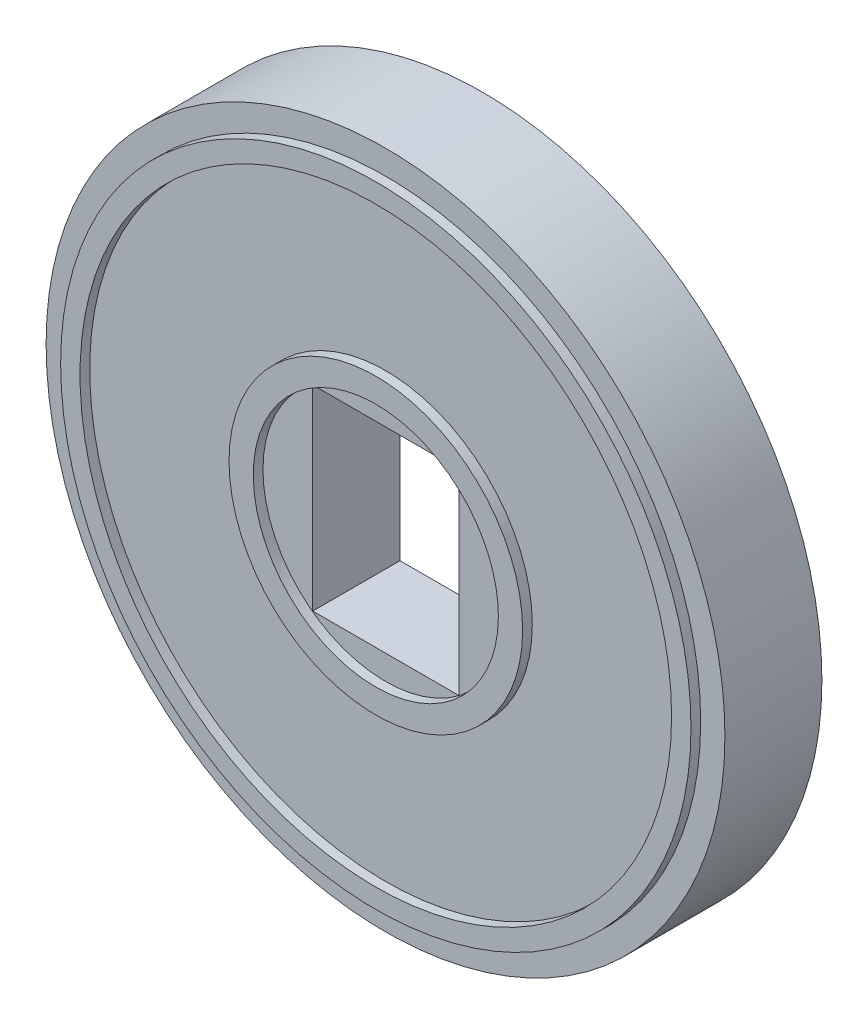
ISO-10303-21;
HEADER;
FILE_DESCRIPTION(('STEP AP214'),'2;1');
FILE_NAME('part.step','',(''),(''),'','','');
FILE_SCHEMA(('AUTOMOTIVE_DESIGN { 1 0 10303 214 1 1 1 1 }'));
ENDSEC;
DATA;
#1=APPLICATION_CONTEXT('core data for automotive mechanical design processes');
#2=APPLICATION_PROTOCOL_DEFINITION('international standard','automotive_design',2000,#1);
#3=PRODUCT_CONTEXT('',#1,'mechanical');
#4=PRODUCT('Part','Part','',(#3));
#5=PRODUCT_RELATED_PRODUCT_CATEGORY('part','',(#4));
#6=PRODUCT_DEFINITION_FORMATION('','',#4);
#7=PRODUCT_DEFINITION_CONTEXT('part definition',#1,'design');
#8=PRODUCT_DEFINITION('design','',#6,#7);
#9=PRODUCT_DEFINITION_SHAPE('','',#8);
#10=(LENGTH_UNIT() NAMED_UNIT(*) SI_UNIT(.MILLI.,.METRE.));
#11=(NAMED_UNIT(*) PLANE_ANGLE_UNIT() SI_UNIT($,.RADIAN.));
#12=(NAMED_UNIT(*) SI_UNIT($,.STERADIAN.) SOLID_ANGLE_UNIT());
#13=UNCERTAINTY_MEASURE_WITH_UNIT(LENGTH_MEASURE(1.E-05),#10,'distance_accuracy_value','');
#14=(GEOMETRIC_REPRESENTATION_CONTEXT(3) GLOBAL_UNCERTAINTY_ASSIGNED_CONTEXT((#13)) GLOBAL_UNIT_ASSIGNED_CONTEXT((#10,
#11,#12)) REPRESENTATION_CONTEXT('',''));
#15=CARTESIAN_POINT('',(0.,0.,0.));
#16=DIRECTION('',(0.,0.,1.));
#17=DIRECTION('',(1.,0.,0.));
#18=AXIS2_PLACEMENT_3D('',#15,#16,#17);
#19=CARTESIAN_POINT('',(0.,0.,10.));
#20=DIRECTION('',(0.,0.,1.));
#21=DIRECTION('',(1.,0.,0.));
#22=AXIS2_PLACEMENT_3D('',#19,#20,#21);
#23=PLANE('',#22);
#24=CARTESIAN_POINT('',(0.,0.,10.));
#25=DIRECTION('',(0.,0.,1.));
#26=DIRECTION('',(1.,0.,0.));
#27=AXIS2_PLACEMENT_3D('',#24,#25,#26);
#28=CIRCLE('',#27,12.6370101289822);
#29=CARTESIAN_POINT('',(7.595,10.1,10.));
#30=VERTEX_POINT('',#29);
#31=CARTESIAN_POINT('',(7.595,-10.1,10.));
#32=VERTEX_POINT('',#31);
#33=EDGE_CURVE('E132',#30,#32,#28,.T.);
#34=ORIENTED_EDGE('',*,*,#33,.T.);
#35=DIRECTION('',(1.,0.,0.));
#36=VECTOR('',#35,1.);
#37=CARTESIAN_POINT('',(-7.505,-10.1,10.));
#38=LINE('',#37,#36);
#39=CARTESIAN_POINT('',(-7.505,-10.1,10.));
#40=VERTEX_POINT('',#39);
#41=EDGE_CURVE('E110',#40,#32,#38,.T.);
#42=ORIENTED_EDGE('',*,*,#41,.F.);
#43=DIRECTION('',(0.,-1.,0.));
#44=VECTOR('',#43,1.);
#45=CARTESIAN_POINT('',(-7.505,10.1,10.));
#46=LINE('',#45,#44);
#47=CARTESIAN_POINT('',(-7.505,10.1,10.));
#48=VERTEX_POINT('',#47);
#49=EDGE_CURVE('E129',#48,#40,#46,.T.);
#50=ORIENTED_EDGE('',*,*,#49,.F.);
#51=DIRECTION('',(-1.,0.,0.));
#52=VECTOR('',#51,1.);
#53=CARTESIAN_POINT('',(-7.505,10.1,10.));
#54=LINE('',#53,#52);
#55=EDGE_CURVE('E109',#30,#48,#54,.T.);
#56=ORIENTED_EDGE('',*,*,#55,.F.);
#57=EDGE_LOOP('',(#34,#42,#50,#56));
#58=FACE_BOUND('',#57,.T.);
#59=ADVANCED_FACE('F46',(#58),#23,.T.);
#60=EDGE_CURVE('E106',#32,#30,#28,.T.);
#61=ORIENTED_EDGE('',*,*,#60,.T.);
#62=DIRECTION('',(0.,1.,0.));
#63=VECTOR('',#62,1.);
#64=CARTESIAN_POINT('',(7.595,10.1,10.));
#65=LINE('',#64,#63);
#66=EDGE_CURVE('E103',#32,#30,#65,.T.);
#67=ORIENTED_EDGE('',*,*,#66,.F.);
#68=EDGE_LOOP('',(#61,#67));
#69=FACE_BOUND('',#68,.T.);
#70=ADVANCED_FACE('F104',(#69),#23,.T.);
#71=CARTESIAN_POINT('',(0.,0.,10.));
#72=DIRECTION('',(0.,0.,1.));
#73=DIRECTION('',(1.,0.,0.));
#74=AXIS2_PLACEMENT_3D('',#71,#72,#73);
#75=CIRCLE('',#74,15.1370101289823);
#76=CARTESIAN_POINT('',(15.1370101289823,0.,10.));
#77=VERTEX_POINT('',#76);
#78=EDGE_CURVE('E149',#77,#77,#75,.T.);
#79=ORIENTED_EDGE('',*,*,#78,.F.);
#80=EDGE_LOOP('',(#79));
#81=FACE_BOUND('',#80,.T.);
#82=CARTESIAN_POINT('',(0.,0.,10.));
#83=DIRECTION('',(0.,0.,1.));
#84=DIRECTION('',(1.,0.,0.));
#85=AXIS2_PLACEMENT_3D('',#82,#83,#84);
#86=CIRCLE('',#85,30.5);
#87=CARTESIAN_POINT('',(30.5,0.,10.));
#88=VERTEX_POINT('',#87);
#89=EDGE_CURVE('E185',#88,#88,#86,.F.);
#90=ORIENTED_EDGE('',*,*,#89,.F.);
#91=EDGE_LOOP('',(#90));
#92=FACE_BOUND('',#91,.T.);
#93=ADVANCED_FACE('F261',(#81,#92),#23,.T.);
#94=CARTESIAN_POINT('',(0.,0.,10.));
#95=DIRECTION('',(0.,0.,1.));
#96=DIRECTION('',(1.,0.,0.));
#97=AXIS2_PLACEMENT_3D('',#94,#95,#96);
#98=CIRCLE('',#97,32.5);
#99=CARTESIAN_POINT('',(32.5,0.,10.));
#100=VERTEX_POINT('',#99);
#101=EDGE_CURVE('E156',#100,#100,#98,.T.);
#102=ORIENTED_EDGE('',*,*,#101,.F.);
#103=EDGE_LOOP('',(#102));
#104=FACE_BOUND('',#103,.T.);
#105=CARTESIAN_POINT('',(0.,0.,10.));
#106=DIRECTION('',(0.,0.,1.));
#107=DIRECTION('',(1.,0.,0.));
#108=AXIS2_PLACEMENT_3D('',#105,#106,#107);
#109=CIRCLE('',#108,35.);
#110=CARTESIAN_POINT('',(35.,0.,10.));
#111=VERTEX_POINT('',#110);
#112=EDGE_CURVE('E181',#111,#111,#109,.T.);
#113=ORIENTED_EDGE('',*,*,#112,.T.);
#114=EDGE_LOOP('',(#113));
#115=FACE_BOUND('',#114,.T.);
#116=ADVANCED_FACE('F257',(#104,#115),#23,.T.);
#117=CARTESIAN_POINT('',(0.,0.,0.));
#118=DIRECTION('',(0.,0.,1.));
#119=DIRECTION('',(1.,0.,0.));
#120=AXIS2_PLACEMENT_3D('',#117,#118,#119);
#121=PLANE('',#120);
#122=DIRECTION('',(-1.,0.,0.));
#123=VECTOR('',#122,1.);
#124=CARTESIAN_POINT('',(-7.505,15.7712818196177,0.));
#125=LINE('',#124,#123);
#126=CARTESIAN_POINT('',(13.2662818196177,15.7712818196177,0.));
#127=VERTEX_POINT('',#126);
#128=CARTESIAN_POINT('',(-13.1762818196177,15.7712818196177,0.));
#129=VERTEX_POINT('',#128);
#130=EDGE_CURVE('E201',#127,#129,#125,.T.);
#131=ORIENTED_EDGE('',*,*,#130,.T.);
#132=DIRECTION('',(0.,-1.,0.));
#133=VECTOR('',#132,1.);
#134=CARTESIAN_POINT('',(-13.1762818196177,-10.1,0.));
#135=LINE('',#134,#133);
#136=CARTESIAN_POINT('',(-13.1762818196177,-15.7712818196177,0.));
#137=VERTEX_POINT('',#136);
#138=EDGE_CURVE('E204',#129,#137,#135,.T.);
#139=ORIENTED_EDGE('',*,*,#138,.T.);
#140=DIRECTION('',(1.,0.,0.));
#141=VECTOR('',#140,1.);
#142=CARTESIAN_POINT('',(7.595,-15.7712818196177,0.));
#143=LINE('',#142,#141);
#144=CARTESIAN_POINT('',(13.2662818196177,-15.7712818196177,0.));
#145=VERTEX_POINT('',#144);
#146=EDGE_CURVE('E195',#137,#145,#143,.T.);
#147=ORIENTED_EDGE('',*,*,#146,.T.);
#148=DIRECTION('',(0.,1.,0.));
#149=VECTOR('',#148,1.);
#150=CARTESIAN_POINT('',(13.2662818196177,10.1,0.));
#151=LINE('',#150,#149);
#152=EDGE_CURVE('E198',#145,#127,#151,.T.);
#153=ORIENTED_EDGE('',*,*,#152,.T.);
#154=EDGE_LOOP('',(#131,#139,#147,#153));
#155=FACE_BOUND('',#154,.T.);
#156=CARTESIAN_POINT('',(0.,25.,0.));
#157=DIRECTION('',(0.,0.,1.));
#158=DIRECTION('',(1.,0.,0.));
#159=AXIS2_PLACEMENT_3D('',#156,#157,#158);
#160=CIRCLE('',#159,5.1);
#161=CARTESIAN_POINT('',(5.1,25.,0.));
#162=VERTEX_POINT('',#161);
#163=EDGE_CURVE('E168',#162,#162,#160,.F.);
#164=ORIENTED_EDGE('',*,*,#163,.F.);
#165=EDGE_LOOP('',(#164));
#166=FACE_BOUND('',#165,.T.);
#167=CARTESIAN_POINT('',(0.,0.,0.));
#168=DIRECTION('',(0.,0.,1.));
#169=DIRECTION('',(1.,0.,0.));
#170=AXIS2_PLACEMENT_3D('',#167,#168,#169);
#171=CIRCLE('',#170,35.);
#172=CARTESIAN_POINT('',(35.,0.,0.));
#173=VERTEX_POINT('',#172);
#174=EDGE_CURVE('E180',#173,#173,#171,.T.);
#175=ORIENTED_EDGE('',*,*,#174,.F.);
#176=EDGE_LOOP('',(#175));
#177=FACE_BOUND('',#176,.T.);
#178=ADVANCED_FACE('F233',(#155,#166,#177),#121,.F.);
#179=CARTESIAN_POINT('',(0.,0.,10.));
#180=DIRECTION('',(0.,0.,-1.));
#181=DIRECTION('',(-1.,0.,0.));
#182=AXIS2_PLACEMENT_3D('',#179,#180,#181);
#183=CYLINDRICAL_SURFACE('',#182,35.);
#184=ORIENTED_EDGE('',*,*,#112,.F.);
#185=EDGE_LOOP('',(#184));
#186=FACE_BOUND('',#185,.T.);
#187=ORIENTED_EDGE('',*,*,#174,.T.);
#188=EDGE_LOOP('',(#187));
#189=FACE_BOUND('',#188,.T.);
#190=ADVANCED_FACE('F270',(#186,#189),#183,.T.);
#191=CARTESIAN_POINT('',(-7.505,10.1,10.));
#192=DIRECTION('',(1.,0.,0.));
#193=DIRECTION('',(0.,1.,0.));
#194=AXIS2_PLACEMENT_3D('',#191,#192,#193);
#195=PLANE('',#194);
#196=DIRECTION('',(0.,0.,-1.));
#197=VECTOR('',#196,1.);
#198=CARTESIAN_POINT('',(-7.505,-10.1,10.));
#199=LINE('',#198,#197);
#200=CARTESIAN_POINT('',(-7.505,-10.1,1.));
#201=VERTEX_POINT('',#200);
#202=EDGE_CURVE('E118',#40,#201,#199,.T.);
#203=ORIENTED_EDGE('',*,*,#202,.T.);
#204=DIRECTION('',(0.,1.,0.));
#205=VECTOR('',#204,1.);
#206=CARTESIAN_POINT('',(-7.505,10.1,1.));
#207=LINE('',#206,#205);
#208=CARTESIAN_POINT('',(-7.505,10.1,1.));
#209=VERTEX_POINT('',#208);
#210=EDGE_CURVE('E208',#201,#209,#207,.T.);
#211=ORIENTED_EDGE('',*,*,#210,.T.);
#212=DIRECTION('',(0.,0.,-1.));
#213=VECTOR('',#212,1.);
#214=CARTESIAN_POINT('',(-7.505,10.1,10.));
#215=LINE('',#214,#213);
#216=EDGE_CURVE('E173',#48,#209,#215,.T.);
#217=ORIENTED_EDGE('',*,*,#216,.F.);
#218=ORIENTED_EDGE('',*,*,#49,.T.);
#219=EDGE_LOOP('',(#203,#211,#217,#218));
#220=FACE_BOUND('',#219,.T.);
#221=ADVANCED_FACE('F242',(#220),#195,.T.);
#222=CARTESIAN_POINT('',(-7.505,-10.1,10.));
#223=DIRECTION('',(0.,1.,0.));
#224=DIRECTION('',(-1.,0.,0.));
#225=AXIS2_PLACEMENT_3D('',#222,#223,#224);
#226=PLANE('',#225);
#227=DIRECTION('',(0.,0.,-1.));
#228=VECTOR('',#227,1.);
#229=CARTESIAN_POINT('',(7.595,-10.1,10.));
#230=LINE('',#229,#228);
#231=CARTESIAN_POINT('',(7.595,-10.1,1.));
#232=VERTEX_POINT('',#231);
#233=EDGE_CURVE('E112',#32,#232,#230,.T.);
#234=ORIENTED_EDGE('',*,*,#233,.T.);
#235=DIRECTION('',(-1.,0.,0.));
#236=VECTOR('',#235,1.);
#237=CARTESIAN_POINT('',(-7.505,-10.1,1.));
#238=LINE('',#237,#236);
#239=EDGE_CURVE('E12',#232,#201,#238,.T.);
#240=ORIENTED_EDGE('',*,*,#239,.T.);
#241=ORIENTED_EDGE('',*,*,#202,.F.);
#242=ORIENTED_EDGE('',*,*,#41,.T.);
#243=EDGE_LOOP('',(#234,#240,#241,#242));
#244=FACE_BOUND('',#243,.T.);
#245=ADVANCED_FACE('F124',(#244),#226,.T.);
#246=CARTESIAN_POINT('',(7.595,10.1,10.));
#247=DIRECTION('',(-1.,0.,0.));
#248=DIRECTION('',(0.,-1.,0.));
#249=AXIS2_PLACEMENT_3D('',#246,#247,#248);
#250=PLANE('',#249);
#251=DIRECTION('',(0.,0.,-1.));
#252=VECTOR('',#251,1.);
#253=CARTESIAN_POINT('',(7.595,10.1,10.));
#254=LINE('',#253,#252);
#255=CARTESIAN_POINT('',(7.595,10.1,1.));
#256=VERTEX_POINT('',#255);
#257=EDGE_CURVE('E119',#30,#256,#254,.T.);
#258=ORIENTED_EDGE('',*,*,#257,.T.);
#259=DIRECTION('',(0.,-1.,0.));
#260=VECTOR('',#259,1.);
#261=CARTESIAN_POINT('',(7.595,-10.1,1.));
#262=LINE('',#261,#260);
#263=EDGE_CURVE('E57',#256,#232,#262,.T.);
#264=ORIENTED_EDGE('',*,*,#263,.T.);
#265=ORIENTED_EDGE('',*,*,#233,.F.);
#266=ORIENTED_EDGE('',*,*,#66,.T.);
#267=EDGE_LOOP('',(#258,#264,#265,#266));
#268=FACE_BOUND('',#267,.T.);
#269=ADVANCED_FACE('F114',(#268),#250,.T.);
#270=CARTESIAN_POINT('',(-7.505,10.1,10.));
#271=DIRECTION('',(0.,-1.,0.));
#272=DIRECTION('',(0.,0.,-1.));
#273=AXIS2_PLACEMENT_3D('',#270,#271,#272);
#274=PLANE('',#273);
#275=ORIENTED_EDGE('',*,*,#216,.T.);
#276=DIRECTION('',(1.,0.,0.));
#277=VECTOR('',#276,1.);
#278=CARTESIAN_POINT('',(7.595,10.1,1.));
#279=LINE('',#278,#277);
#280=EDGE_CURVE('E72',#209,#256,#279,.T.);
#281=ORIENTED_EDGE('',*,*,#280,.T.);
#282=ORIENTED_EDGE('',*,*,#257,.F.);
#283=ORIENTED_EDGE('',*,*,#55,.T.);
#284=EDGE_LOOP('',(#275,#281,#282,#283));
#285=FACE_BOUND('',#284,.T.);
#286=ADVANCED_FACE('F243',(#285),#274,.T.);
#287=CARTESIAN_POINT('',(0.,25.,-1.));
#288=DIRECTION('',(0.,0.,1.));
#289=DIRECTION('',(1.,0.,0.));
#290=AXIS2_PLACEMENT_3D('',#287,#288,#289);
#291=CYLINDRICAL_SURFACE('',#290,5.1);
#292=CARTESIAN_POINT('',(0.,25.,8.));
#293=DIRECTION('',(0.,0.,-1.));
#294=DIRECTION('',(-1.,0.,0.));
#295=AXIS2_PLACEMENT_3D('',#292,#293,#294);
#296=CIRCLE('',#295,5.1);
#297=CARTESIAN_POINT('',(-5.1,25.,8.));
#298=VERTEX_POINT('',#297);
#299=EDGE_CURVE('E161',#298,#298,#296,.T.);
#300=ORIENTED_EDGE('',*,*,#299,.F.);
#301=EDGE_LOOP('',(#300));
#302=FACE_BOUND('',#301,.T.);
#303=ORIENTED_EDGE('',*,*,#163,.T.);
#304=EDGE_LOOP('',(#303));
#305=FACE_BOUND('',#304,.T.);
#306=ADVANCED_FACE('F245',(#302,#305),#291,.F.);
#307=CARTESIAN_POINT('',(0.,25.,8.));
#308=DIRECTION('',(0.,0.,-1.));
#309=DIRECTION('',(-1.,0.,0.));
#310=AXIS2_PLACEMENT_3D('',#307,#308,#309);
#311=PLANE('',#310);
#312=ORIENTED_EDGE('',*,*,#299,.T.);
#313=EDGE_LOOP('',(#312));
#314=FACE_BOUND('',#313,.T.);
#315=ADVANCED_FACE('F251',(#314),#311,.T.);
#316=CARTESIAN_POINT('',(0.,0.,11.));
#317=DIRECTION('',(0.,0.,1.));
#318=DIRECTION('',(1.,0.,0.));
#319=AXIS2_PLACEMENT_3D('',#316,#317,#318);
#320=PLANE('',#319);
#321=CARTESIAN_POINT('',(0.,0.,11.));
#322=DIRECTION('',(0.,0.,1.));
#323=DIRECTION('',(1.,0.,0.));
#324=AXIS2_PLACEMENT_3D('',#321,#322,#323);
#325=CIRCLE('',#324,32.5);
#326=CARTESIAN_POINT('',(32.5,0.,11.));
#327=VERTEX_POINT('',#326);
#328=EDGE_CURVE('E157',#327,#327,#325,.T.);
#329=ORIENTED_EDGE('',*,*,#328,.T.);
#330=EDGE_LOOP('',(#329));
#331=FACE_BOUND('',#330,.T.);
#332=CARTESIAN_POINT('',(0.,0.,11.));
#333=DIRECTION('',(0.,0.,1.));
#334=DIRECTION('',(1.,0.,0.));
#335=AXIS2_PLACEMENT_3D('',#332,#333,#334);
#336=CIRCLE('',#335,30.5);
#337=CARTESIAN_POINT('',(30.5,0.,11.));
#338=VERTEX_POINT('',#337);
#339=EDGE_CURVE('E148',#338,#338,#336,.T.);
#340=ORIENTED_EDGE('',*,*,#339,.F.);
#341=EDGE_LOOP('',(#340));
#342=FACE_BOUND('',#341,.T.);
#343=ADVANCED_FACE('F325',(#331,#342),#320,.T.);
#344=CARTESIAN_POINT('',(0.,0.,11.));
#345=DIRECTION('',(0.,0.,-1.));
#346=DIRECTION('',(-1.,0.,0.));
#347=AXIS2_PLACEMENT_3D('',#344,#345,#346);
#348=CYLINDRICAL_SURFACE('',#347,32.5);
#349=ORIENTED_EDGE('',*,*,#328,.F.);
#350=EDGE_LOOP('',(#349));
#351=FACE_BOUND('',#350,.T.);
#352=ORIENTED_EDGE('',*,*,#101,.T.);
#353=EDGE_LOOP('',(#352));
#354=FACE_BOUND('',#353,.T.);
#355=ADVANCED_FACE('F323',(#351,#354),#348,.T.);
#356=CARTESIAN_POINT('',(0.,0.,11.));
#357=DIRECTION('',(0.,0.,-1.));
#358=DIRECTION('',(-1.,0.,0.));
#359=AXIS2_PLACEMENT_3D('',#356,#357,#358);
#360=CYLINDRICAL_SURFACE('',#359,30.5);
#361=ORIENTED_EDGE('',*,*,#339,.T.);
#362=EDGE_LOOP('',(#361));
#363=FACE_BOUND('',#362,.T.);
#364=ORIENTED_EDGE('',*,*,#89,.T.);
#365=EDGE_LOOP('',(#364));
#366=FACE_BOUND('',#365,.T.);
#367=ADVANCED_FACE('F318',(#363,#366),#360,.F.);
#368=CARTESIAN_POINT('',(0.,0.,11.));
#369=DIRECTION('',(0.,0.,1.));
#370=DIRECTION('',(1.,0.,0.));
#371=AXIS2_PLACEMENT_3D('',#368,#369,#370);
#372=PLANE('',#371);
#373=CARTESIAN_POINT('',(0.,0.,11.));
#374=DIRECTION('',(0.,0.,1.));
#375=DIRECTION('',(1.,0.,0.));
#376=AXIS2_PLACEMENT_3D('',#373,#374,#375);
#377=CIRCLE('',#376,15.1370101289823);
#378=CARTESIAN_POINT('',(15.1370101289823,0.,11.));
#379=VERTEX_POINT('',#378);
#380=EDGE_CURVE('E144',#379,#379,#377,.T.);
#381=ORIENTED_EDGE('',*,*,#380,.T.);
#382=EDGE_LOOP('',(#381));
#383=FACE_BOUND('',#382,.T.);
#384=CARTESIAN_POINT('',(0.,0.,11.));
#385=DIRECTION('',(0.,0.,1.));
#386=DIRECTION('',(1.,0.,0.));
#387=AXIS2_PLACEMENT_3D('',#384,#385,#386);
#388=CIRCLE('',#387,12.6370101289822);
#389=CARTESIAN_POINT('',(12.6370101289822,0.,11.));
#390=VERTEX_POINT('',#389);
#391=EDGE_CURVE('E135',#390,#390,#388,.T.);
#392=ORIENTED_EDGE('',*,*,#391,.F.);
#393=EDGE_LOOP('',(#392));
#394=FACE_BOUND('',#393,.T.);
#395=ADVANCED_FACE('F312',(#383,#394),#372,.T.);
#396=CARTESIAN_POINT('',(0.,0.,11.));
#397=DIRECTION('',(0.,0.,-1.));
#398=DIRECTION('',(-1.,0.,0.));
#399=AXIS2_PLACEMENT_3D('',#396,#397,#398);
#400=CYLINDRICAL_SURFACE('',#399,15.1370101289823);
#401=ORIENTED_EDGE('',*,*,#380,.F.);
#402=EDGE_LOOP('',(#401));
#403=FACE_BOUND('',#402,.T.);
#404=ORIENTED_EDGE('',*,*,#78,.T.);
#405=EDGE_LOOP('',(#404));
#406=FACE_BOUND('',#405,.T.);
#407=ADVANCED_FACE('F306',(#403,#406),#400,.T.);
#408=CARTESIAN_POINT('',(0.,0.,11.));
#409=DIRECTION('',(0.,0.,-1.));
#410=DIRECTION('',(-1.,0.,0.));
#411=AXIS2_PLACEMENT_3D('',#408,#409,#410);
#412=CYLINDRICAL_SURFACE('',#411,12.6370101289822);
#413=ORIENTED_EDGE('',*,*,#391,.T.);
#414=EDGE_LOOP('',(#413));
#415=FACE_BOUND('',#414,.T.);
#416=ORIENTED_EDGE('',*,*,#33,.F.);
#417=ORIENTED_EDGE('',*,*,#60,.F.);
#418=EDGE_LOOP('',(#416,#417));
#419=FACE_BOUND('',#418,.T.);
#420=ADVANCED_FACE('F137',(#415,#419),#412,.F.);
#421=CARTESIAN_POINT('',(13.2662818196177,0.,0.));
#422=DIRECTION('',(-0.173648177666931,0.,-0.984807753012208));
#423=DIRECTION('',(0.,-1.,0.));
#424=AXIS2_PLACEMENT_3D('',#421,#422,#423);
#425=PLANE('',#424);
#426=DIRECTION('',(0.701673843159863,-0.701673843159863,-0.123724030206484));
#427=VECTOR('',#426,1.);
#428=CARTESIAN_POINT('',(5.50135142772715,-8.00635142772715,1.36916673141346));
#429=LINE('',#428,#427);
#430=EDGE_CURVE('E141',#232,#145,#429,.T.);
#431=ORIENTED_EDGE('',*,*,#430,.F.);
#432=ORIENTED_EDGE('',*,*,#263,.F.);
#433=DIRECTION('',(0.701673843159863,0.701673843159863,-0.123724030206484));
#434=VECTOR('',#433,1.);
#435=CARTESIAN_POINT('',(6.73467861407486,9.23967861407486,1.1516978724191));
#436=LINE('',#435,#434);
#437=EDGE_CURVE('E51',#127,#256,#436,.F.);
#438=ORIENTED_EDGE('',*,*,#437,.F.);
#439=ORIENTED_EDGE('',*,*,#152,.F.);
#440=EDGE_LOOP('',(#431,#432,#438,#439));
#441=FACE_BOUND('',#440,.T.);
#442=ADVANCED_FACE('F49',(#441),#425,.T.);
#443=CARTESIAN_POINT('',(0.,15.7712818196177,0.));
#444=DIRECTION('',(0.,-0.173648177666931,-0.984807753012208));
#445=DIRECTION('',(1.,0.,0.));
#446=AXIS2_PLACEMENT_3D('',#443,#444,#445);
#447=PLANE('',#446);
#448=ORIENTED_EDGE('',*,*,#437,.T.);
#449=ORIENTED_EDGE('',*,*,#280,.F.);
#450=DIRECTION('',(-0.701673843159864,0.701673843159863,-0.123724030206484));
#451=VECTOR('',#450,1.);
#452=CARTESIAN_POINT('',(-5.41135142772715,8.00635142772716,1.36916673141346));
#453=LINE('',#452,#451);
#454=EDGE_CURVE('E219',#129,#209,#453,.F.);
#455=ORIENTED_EDGE('',*,*,#454,.F.);
#456=ORIENTED_EDGE('',*,*,#130,.F.);
#457=EDGE_LOOP('',(#448,#449,#455,#456));
#458=FACE_BOUND('',#457,.T.);
#459=ADVANCED_FACE('F295',(#458),#447,.T.);
#460=CARTESIAN_POINT('',(0.,-15.7712818196177,0.));
#461=DIRECTION('',(0.,0.173648177666931,-0.984807753012208));
#462=DIRECTION('',(-1.,0.,0.));
#463=AXIS2_PLACEMENT_3D('',#460,#461,#462);
#464=PLANE('',#463);
#465=ORIENTED_EDGE('',*,*,#430,.T.);
#466=ORIENTED_EDGE('',*,*,#146,.F.);
#467=DIRECTION('',(0.701673843159863,0.701673843159863,0.123724030206484));
#468=VECTOR('',#467,1.);
#469=CARTESIAN_POINT('',(-5.41135142772715,-8.00635142772716,1.36916673141346));
#470=LINE('',#469,#468);
#471=EDGE_CURVE('E216',#201,#137,#470,.F.);
#472=ORIENTED_EDGE('',*,*,#471,.F.);
#473=ORIENTED_EDGE('',*,*,#239,.F.);
#474=EDGE_LOOP('',(#465,#466,#472,#473));
#475=FACE_BOUND('',#474,.T.);
#476=ADVANCED_FACE('F226',(#475),#464,.T.);
#477=CARTESIAN_POINT('',(-13.1762818196177,0.,0.));
#478=DIRECTION('',(0.173648177666931,0.,-0.984807753012208));
#479=DIRECTION('',(0.,1.,0.));
#480=AXIS2_PLACEMENT_3D('',#477,#478,#479);
#481=PLANE('',#480);
#482=ORIENTED_EDGE('',*,*,#454,.T.);
#483=ORIENTED_EDGE('',*,*,#210,.F.);
#484=ORIENTED_EDGE('',*,*,#471,.T.);
#485=ORIENTED_EDGE('',*,*,#138,.F.);
#486=EDGE_LOOP('',(#482,#483,#484,#485));
#487=FACE_BOUND('',#486,.T.);
#488=ADVANCED_FACE('F238',(#487),#481,.T.);
#489=CLOSED_SHELL('',(#59,#70,#93,#116,#178,#190,#221,#245,#269,#286,#306,#315,#343,#355,#367,
#395,#407,#420,#442,#459,#476,#488));
#490=MANIFOLD_SOLID_BREP('B2',#489);
#491=ADVANCED_BREP_SHAPE_REPRESENTATION('',(#18,#490),#14);
#492=SHAPE_DEFINITION_REPRESENTATION(#9,#491);
ENDSEC;
END-ISO-10303-21;
